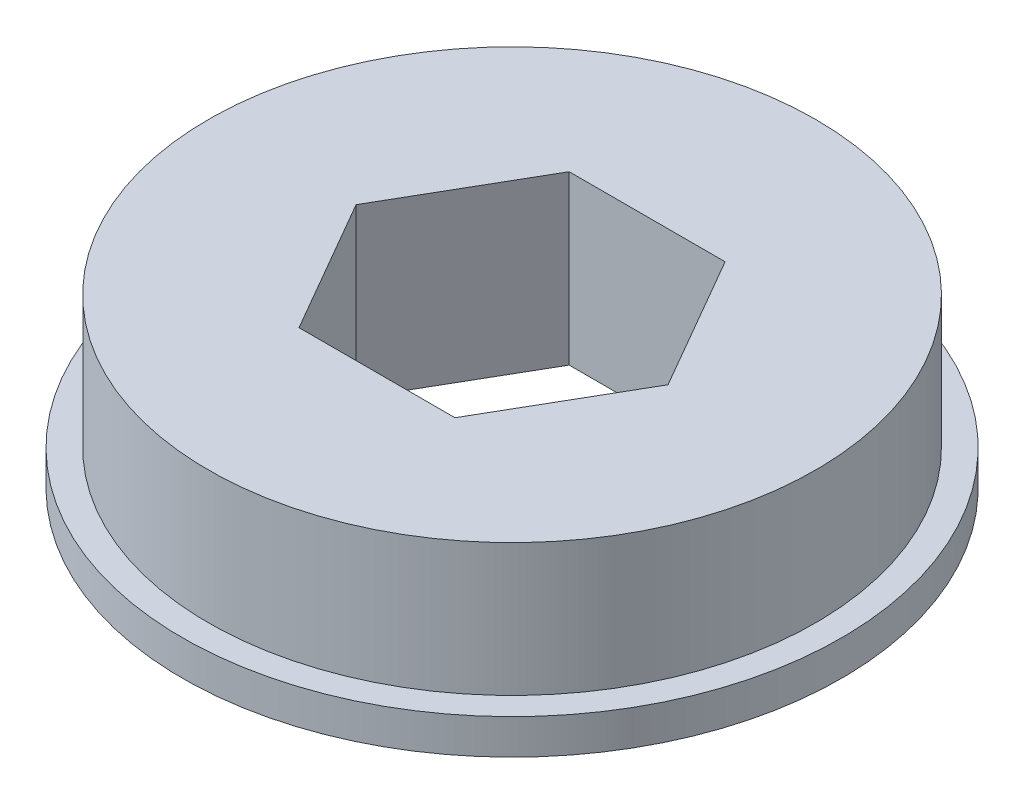
ISO-10303-21;
HEADER;
FILE_DESCRIPTION(('STEP AP214'),'2;1');
FILE_NAME('part.step','',(''),(''),'','','');
FILE_SCHEMA(('AUTOMOTIVE_DESIGN { 1 0 10303 214 1 1 1 1 }'));
ENDSEC;
DATA;
#1=APPLICATION_CONTEXT('core data for automotive mechanical design processes');
#2=APPLICATION_PROTOCOL_DEFINITION('international standard','automotive_design',2000,#1);
#3=PRODUCT_CONTEXT('',#1,'mechanical');
#4=PRODUCT('Part','Part','',(#3));
#5=PRODUCT_RELATED_PRODUCT_CATEGORY('part','',(#4));
#6=PRODUCT_DEFINITION_FORMATION('','',#4);
#7=PRODUCT_DEFINITION_CONTEXT('part definition',#1,'design');
#8=PRODUCT_DEFINITION('design','',#6,#7);
#9=PRODUCT_DEFINITION_SHAPE('','',#8);
#10=(LENGTH_UNIT() NAMED_UNIT(*) SI_UNIT(.MILLI.,.METRE.));
#11=(NAMED_UNIT(*) PLANE_ANGLE_UNIT() SI_UNIT($,.RADIAN.));
#12=(NAMED_UNIT(*) SI_UNIT($,.STERADIAN.) SOLID_ANGLE_UNIT());
#13=UNCERTAINTY_MEASURE_WITH_UNIT(LENGTH_MEASURE(1.E-05),#10,'distance_accuracy_value','');
#14=(GEOMETRIC_REPRESENTATION_CONTEXT(3) GLOBAL_UNCERTAINTY_ASSIGNED_CONTEXT((#13)) GLOBAL_UNIT_ASSIGNED_CONTEXT((#10,
#11,#12)) REPRESENTATION_CONTEXT('',''));
#15=CARTESIAN_POINT('',(0.,0.,0.));
#16=DIRECTION('',(0.,0.,1.));
#17=DIRECTION('',(1.,0.,0.));
#18=AXIS2_PLACEMENT_3D('',#15,#16,#17);
#19=CARTESIAN_POINT('',(0.,7.874,0.));
#20=DIRECTION('',(0.,1.,0.));
#21=DIRECTION('',(0.,0.,1.));
#22=AXIS2_PLACEMENT_3D('',#19,#20,#21);
#23=PLANE('',#22);
#24=DIRECTION('',(-1.,0.,0.));
#25=VECTOR('',#24,1.);
#26=CARTESIAN_POINT('',(3.66617420935412,7.874,-6.35));
#27=LINE('',#26,#25);
#28=CARTESIAN_POINT('',(3.66617420935412,7.874,-6.35));
#29=VERTEX_POINT('',#28);
#30=CARTESIAN_POINT('',(-3.66617420935412,7.874,-6.35));
#31=VERTEX_POINT('',#30);
#32=EDGE_CURVE('E58',#29,#31,#27,.T.);
#33=ORIENTED_EDGE('',*,*,#32,.F.);
#34=DIRECTION('',(-0.5,0.,-0.866025403784439));
#35=VECTOR('',#34,1.);
#36=CARTESIAN_POINT('',(7.33234841870825,7.874,0.));
#37=LINE('',#36,#35);
#38=CARTESIAN_POINT('',(7.33234841870825,7.874,0.));
#39=VERTEX_POINT('',#38);
#40=EDGE_CURVE('E118',#39,#29,#37,.T.);
#41=ORIENTED_EDGE('',*,*,#40,.F.);
#42=DIRECTION('',(0.5,0.,-0.866025403784438));
#43=VECTOR('',#42,1.);
#44=CARTESIAN_POINT('',(3.66617420935413,7.874,6.35));
#45=LINE('',#44,#43);
#46=CARTESIAN_POINT('',(3.66617420935413,7.874,6.35));
#47=VERTEX_POINT('',#46);
#48=EDGE_CURVE('E122',#47,#39,#45,.T.);
#49=ORIENTED_EDGE('',*,*,#48,.F.);
#50=DIRECTION('',(1.,0.,0.));
#51=VECTOR('',#50,1.);
#52=CARTESIAN_POINT('',(-3.66617420935412,7.874,6.35));
#53=LINE('',#52,#51);
#54=CARTESIAN_POINT('',(-3.66617420935412,7.874,6.35));
#55=VERTEX_POINT('',#54);
#56=EDGE_CURVE('E145',#55,#47,#53,.T.);
#57=ORIENTED_EDGE('',*,*,#56,.F.);
#58=DIRECTION('',(0.5,0.,0.866025403784439));
#59=VECTOR('',#58,1.);
#60=CARTESIAN_POINT('',(-7.33234841870825,7.874,0.));
#61=LINE('',#60,#59);
#62=CARTESIAN_POINT('',(-7.33234841870825,7.874,0.));
#63=VERTEX_POINT('',#62);
#64=EDGE_CURVE('E141',#63,#55,#61,.T.);
#65=ORIENTED_EDGE('',*,*,#64,.F.);
#66=DIRECTION('',(-0.5,0.,0.866025403784438));
#67=VECTOR('',#66,1.);
#68=CARTESIAN_POINT('',(-3.66617420935412,7.874,-6.35));
#69=LINE('',#68,#67);
#70=EDGE_CURVE('E138',#31,#63,#69,.T.);
#71=ORIENTED_EDGE('',*,*,#70,.F.);
#72=EDGE_LOOP('',(#33,#41,#49,#57,#65,#71));
#73=FACE_BOUND('',#72,.T.);
#74=CARTESIAN_POINT('',(0.,7.874,0.));
#75=DIRECTION('',(0.,-1.,0.));
#76=DIRECTION('',(0.,0.,-1.));
#77=AXIS2_PLACEMENT_3D('',#74,#75,#76);
#78=CIRCLE('',#77,14.2748);
#79=CARTESIAN_POINT('',(0.,7.874,-14.2748));
#80=VERTEX_POINT('',#79);
#81=EDGE_CURVE('E11',#80,#80,#78,.T.);
#82=ORIENTED_EDGE('',*,*,#81,.F.);
#83=EDGE_LOOP('',(#82));
#84=FACE_BOUND('',#83,.T.);
#85=ADVANCED_FACE('F43',(#73,#84),#23,.T.);
#86=CARTESIAN_POINT('',(0.,0.,0.));
#87=DIRECTION('',(0.,-1.,0.));
#88=DIRECTION('',(0.,0.,-1.));
#89=AXIS2_PLACEMENT_3D('',#86,#87,#88);
#90=CYLINDRICAL_SURFACE('',#89,14.2748);
#91=ORIENTED_EDGE('',*,*,#81,.T.);
#92=EDGE_LOOP('',(#91));
#93=FACE_BOUND('',#92,.T.);
#94=CARTESIAN_POINT('',(0.,1.651,0.));
#95=DIRECTION('',(0.,-1.,0.));
#96=DIRECTION('',(0.,0.,-1.));
#97=AXIS2_PLACEMENT_3D('',#94,#95,#96);
#98=CIRCLE('',#97,14.2748);
#99=CARTESIAN_POINT('',(0.,1.651,-14.2748));
#100=VERTEX_POINT('',#99);
#101=EDGE_CURVE('E51',#100,#100,#98,.T.);
#102=ORIENTED_EDGE('',*,*,#101,.F.);
#103=EDGE_LOOP('',(#102));
#104=FACE_BOUND('',#103,.T.);
#105=ADVANCED_FACE('F180',(#93,#104),#90,.T.);
#106=CARTESIAN_POINT('',(0.,1.651,-14.2748));
#107=DIRECTION('',(0.,1.,0.));
#108=DIRECTION('',(0.,0.,1.));
#109=AXIS2_PLACEMENT_3D('',#106,#107,#108);
#110=PLANE('',#109);
#111=ORIENTED_EDGE('',*,*,#101,.T.);
#112=EDGE_LOOP('',(#111));
#113=FACE_BOUND('',#112,.T.);
#114=CARTESIAN_POINT('',(0.,1.651,0.));
#115=DIRECTION('',(0.,-1.,0.));
#116=DIRECTION('',(0.,0.,-1.));
#117=AXIS2_PLACEMENT_3D('',#114,#115,#116);
#118=CIRCLE('',#117,15.494);
#119=CARTESIAN_POINT('',(0.,1.651,-15.494));
#120=VERTEX_POINT('',#119);
#121=EDGE_CURVE('E170',#120,#120,#118,.T.);
#122=ORIENTED_EDGE('',*,*,#121,.F.);
#123=EDGE_LOOP('',(#122));
#124=FACE_BOUND('',#123,.T.);
#125=ADVANCED_FACE('F177',(#113,#124),#110,.T.);
#126=CARTESIAN_POINT('',(0.,0.,0.));
#127=DIRECTION('',(0.,-1.,0.));
#128=DIRECTION('',(0.,0.,-1.));
#129=AXIS2_PLACEMENT_3D('',#126,#127,#128);
#130=CYLINDRICAL_SURFACE('',#129,15.494);
#131=ORIENTED_EDGE('',*,*,#121,.T.);
#132=EDGE_LOOP('',(#131));
#133=FACE_BOUND('',#132,.T.);
#134=CARTESIAN_POINT('',(0.,0.,0.));
#135=DIRECTION('',(0.,-1.,0.));
#136=DIRECTION('',(0.,0.,-1.));
#137=AXIS2_PLACEMENT_3D('',#134,#135,#136);
#138=CIRCLE('',#137,15.494);
#139=CARTESIAN_POINT('',(0.,0.,-15.494));
#140=VERTEX_POINT('',#139);
#141=EDGE_CURVE('E155',#140,#140,#138,.T.);
#142=ORIENTED_EDGE('',*,*,#141,.F.);
#143=EDGE_LOOP('',(#142));
#144=FACE_BOUND('',#143,.T.);
#145=ADVANCED_FACE('F187',(#133,#144),#130,.T.);
#146=CARTESIAN_POINT('',(0.,0.,-15.494));
#147=DIRECTION('',(0.,-1.,0.));
#148=DIRECTION('',(0.,0.,-1.));
#149=AXIS2_PLACEMENT_3D('',#146,#147,#148);
#150=PLANE('',#149);
#151=DIRECTION('',(-1.,0.,0.));
#152=VECTOR('',#151,1.);
#153=CARTESIAN_POINT('',(3.66617420935412,0.,-6.35));
#154=LINE('',#153,#152);
#155=CARTESIAN_POINT('',(3.66617420935412,0.,-6.35));
#156=VERTEX_POINT('',#155);
#157=CARTESIAN_POINT('',(-3.66617420935412,0.,-6.35));
#158=VERTEX_POINT('',#157);
#159=EDGE_CURVE('E98',#156,#158,#154,.T.);
#160=ORIENTED_EDGE('',*,*,#159,.T.);
#161=DIRECTION('',(-0.5,0.,0.866025403784438));
#162=VECTOR('',#161,1.);
#163=CARTESIAN_POINT('',(-3.66617420935412,0.,-6.35));
#164=LINE('',#163,#162);
#165=CARTESIAN_POINT('',(-7.33234841870825,0.,0.));
#166=VERTEX_POINT('',#165);
#167=EDGE_CURVE('E108',#158,#166,#164,.T.);
#168=ORIENTED_EDGE('',*,*,#167,.T.);
#169=DIRECTION('',(0.5,0.,0.866025403784439));
#170=VECTOR('',#169,1.);
#171=CARTESIAN_POINT('',(-7.33234841870825,0.,0.));
#172=LINE('',#171,#170);
#173=CARTESIAN_POINT('',(-3.66617420935412,0.,6.35));
#174=VERTEX_POINT('',#173);
#175=EDGE_CURVE('E66',#166,#174,#172,.T.);
#176=ORIENTED_EDGE('',*,*,#175,.T.);
#177=DIRECTION('',(1.,0.,0.));
#178=VECTOR('',#177,1.);
#179=CARTESIAN_POINT('',(-3.66617420935412,0.,6.35));
#180=LINE('',#179,#178);
#181=CARTESIAN_POINT('',(3.66617420935413,0.,6.35));
#182=VERTEX_POINT('',#181);
#183=EDGE_CURVE('E127',#174,#182,#180,.T.);
#184=ORIENTED_EDGE('',*,*,#183,.T.);
#185=DIRECTION('',(0.5,0.,-0.866025403784438));
#186=VECTOR('',#185,1.);
#187=CARTESIAN_POINT('',(3.66617420935413,0.,6.35));
#188=LINE('',#187,#186);
#189=CARTESIAN_POINT('',(7.33234841870825,0.,0.));
#190=VERTEX_POINT('',#189);
#191=EDGE_CURVE('E131',#182,#190,#188,.T.);
#192=ORIENTED_EDGE('',*,*,#191,.T.);
#193=DIRECTION('',(-0.5,0.,-0.866025403784439));
#194=VECTOR('',#193,1.);
#195=CARTESIAN_POINT('',(7.33234841870825,0.,0.));
#196=LINE('',#195,#194);
#197=EDGE_CURVE('E105',#190,#156,#196,.T.);
#198=ORIENTED_EDGE('',*,*,#197,.T.);
#199=EDGE_LOOP('',(#160,#168,#176,#184,#192,#198));
#200=FACE_BOUND('',#199,.T.);
#201=ORIENTED_EDGE('',*,*,#141,.T.);
#202=EDGE_LOOP('',(#201));
#203=FACE_BOUND('',#202,.T.);
#204=ADVANCED_FACE('F113',(#200,#203),#150,.T.);
#205=CARTESIAN_POINT('',(3.66617420935412,0.,-6.35));
#206=DIRECTION('',(0.,0.,-1.));
#207=DIRECTION('',(-1.,0.,0.));
#208=AXIS2_PLACEMENT_3D('',#205,#206,#207);
#209=PLANE('',#208);
#210=ORIENTED_EDGE('',*,*,#32,.T.);
#211=DIRECTION('',(0.,1.,0.));
#212=VECTOR('',#211,1.);
#213=CARTESIAN_POINT('',(-3.66617420935412,0.,-6.35));
#214=LINE('',#213,#212);
#215=EDGE_CURVE('E94',#158,#31,#214,.T.);
#216=ORIENTED_EDGE('',*,*,#215,.F.);
#217=ORIENTED_EDGE('',*,*,#159,.F.);
#218=DIRECTION('',(0.,1.,0.));
#219=VECTOR('',#218,1.);
#220=CARTESIAN_POINT('',(3.66617420935412,0.,-6.35));
#221=LINE('',#220,#219);
#222=EDGE_CURVE('E152',#156,#29,#221,.T.);
#223=ORIENTED_EDGE('',*,*,#222,.T.);
#224=EDGE_LOOP('',(#210,#216,#217,#223));
#225=FACE_BOUND('',#224,.T.);
#226=ADVANCED_FACE('F96',(#225),#209,.F.);
#227=CARTESIAN_POINT('',(7.33234841870825,0.,0.));
#228=DIRECTION('',(0.866025403784439,0.,-0.5));
#229=DIRECTION('',(-0.5,0.,-0.866025403784439));
#230=AXIS2_PLACEMENT_3D('',#227,#228,#229);
#231=PLANE('',#230);
#232=ORIENTED_EDGE('',*,*,#40,.T.);
#233=ORIENTED_EDGE('',*,*,#222,.F.);
#234=ORIENTED_EDGE('',*,*,#197,.F.);
#235=DIRECTION('',(0.,1.,0.));
#236=VECTOR('',#235,1.);
#237=CARTESIAN_POINT('',(7.33234841870825,0.,0.));
#238=LINE('',#237,#236);
#239=EDGE_CURVE('E156',#190,#39,#238,.T.);
#240=ORIENTED_EDGE('',*,*,#239,.T.);
#241=EDGE_LOOP('',(#232,#233,#234,#240));
#242=FACE_BOUND('',#241,.T.);
#243=ADVANCED_FACE('F198',(#242),#231,.F.);
#244=CARTESIAN_POINT('',(3.66617420935413,0.,6.35));
#245=DIRECTION('',(0.866025403784439,0.,0.5));
#246=DIRECTION('',(0.5,0.,-0.866025403784438));
#247=AXIS2_PLACEMENT_3D('',#244,#245,#246);
#248=PLANE('',#247);
#249=ORIENTED_EDGE('',*,*,#48,.T.);
#250=ORIENTED_EDGE('',*,*,#239,.F.);
#251=ORIENTED_EDGE('',*,*,#191,.F.);
#252=DIRECTION('',(0.,1.,0.));
#253=VECTOR('',#252,1.);
#254=CARTESIAN_POINT('',(3.66617420935413,0.,6.35));
#255=LINE('',#254,#253);
#256=EDGE_CURVE('E159',#182,#47,#255,.T.);
#257=ORIENTED_EDGE('',*,*,#256,.T.);
#258=EDGE_LOOP('',(#249,#250,#251,#257));
#259=FACE_BOUND('',#258,.T.);
#260=ADVANCED_FACE('F207',(#259),#248,.F.);
#261=CARTESIAN_POINT('',(-3.66617420935412,0.,6.35));
#262=DIRECTION('',(0.,0.,1.));
#263=DIRECTION('',(1.,0.,0.));
#264=AXIS2_PLACEMENT_3D('',#261,#262,#263);
#265=PLANE('',#264);
#266=ORIENTED_EDGE('',*,*,#56,.T.);
#267=ORIENTED_EDGE('',*,*,#256,.F.);
#268=ORIENTED_EDGE('',*,*,#183,.F.);
#269=DIRECTION('',(0.,1.,0.));
#270=VECTOR('',#269,1.);
#271=CARTESIAN_POINT('',(-3.66617420935412,0.,6.35));
#272=LINE('',#271,#270);
#273=EDGE_CURVE('E162',#174,#55,#272,.T.);
#274=ORIENTED_EDGE('',*,*,#273,.T.);
#275=EDGE_LOOP('',(#266,#267,#268,#274));
#276=FACE_BOUND('',#275,.T.);
#277=ADVANCED_FACE('F204',(#276),#265,.F.);
#278=CARTESIAN_POINT('',(-7.33234841870825,0.,0.));
#279=DIRECTION('',(-0.866025403784439,0.,0.5));
#280=DIRECTION('',(0.5,0.,0.866025403784439));
#281=AXIS2_PLACEMENT_3D('',#278,#279,#280);
#282=PLANE('',#281);
#283=ORIENTED_EDGE('',*,*,#64,.T.);
#284=ORIENTED_EDGE('',*,*,#273,.F.);
#285=ORIENTED_EDGE('',*,*,#175,.F.);
#286=DIRECTION('',(0.,1.,0.));
#287=VECTOR('',#286,1.);
#288=CARTESIAN_POINT('',(-7.33234841870825,0.,0.));
#289=LINE('',#288,#287);
#290=EDGE_CURVE('E104',#166,#63,#289,.T.);
#291=ORIENTED_EDGE('',*,*,#290,.T.);
#292=EDGE_LOOP('',(#283,#284,#285,#291));
#293=FACE_BOUND('',#292,.T.);
#294=ADVANCED_FACE('F201',(#293),#282,.F.);
#295=CARTESIAN_POINT('',(-3.66617420935412,0.,-6.35));
#296=DIRECTION('',(-0.866025403784439,0.,-0.5));
#297=DIRECTION('',(-0.5,0.,0.866025403784439));
#298=AXIS2_PLACEMENT_3D('',#295,#296,#297);
#299=PLANE('',#298);
#300=ORIENTED_EDGE('',*,*,#70,.T.);
#301=ORIENTED_EDGE('',*,*,#290,.F.);
#302=ORIENTED_EDGE('',*,*,#167,.F.);
#303=ORIENTED_EDGE('',*,*,#215,.T.);
#304=EDGE_LOOP('',(#300,#301,#302,#303));
#305=FACE_BOUND('',#304,.T.);
#306=ADVANCED_FACE('F109',(#305),#299,.F.);
#307=CLOSED_SHELL('',(#85,#105,#125,#145,#204,#226,#243,#260,#277,#294,#306));
#308=MANIFOLD_SOLID_BREP('B2',#307);
#309=ADVANCED_BREP_SHAPE_REPRESENTATION('',(#18,#308),#14);
#310=SHAPE_DEFINITION_REPRESENTATION(#9,#309);
ENDSEC;
END-ISO-10303-21;
